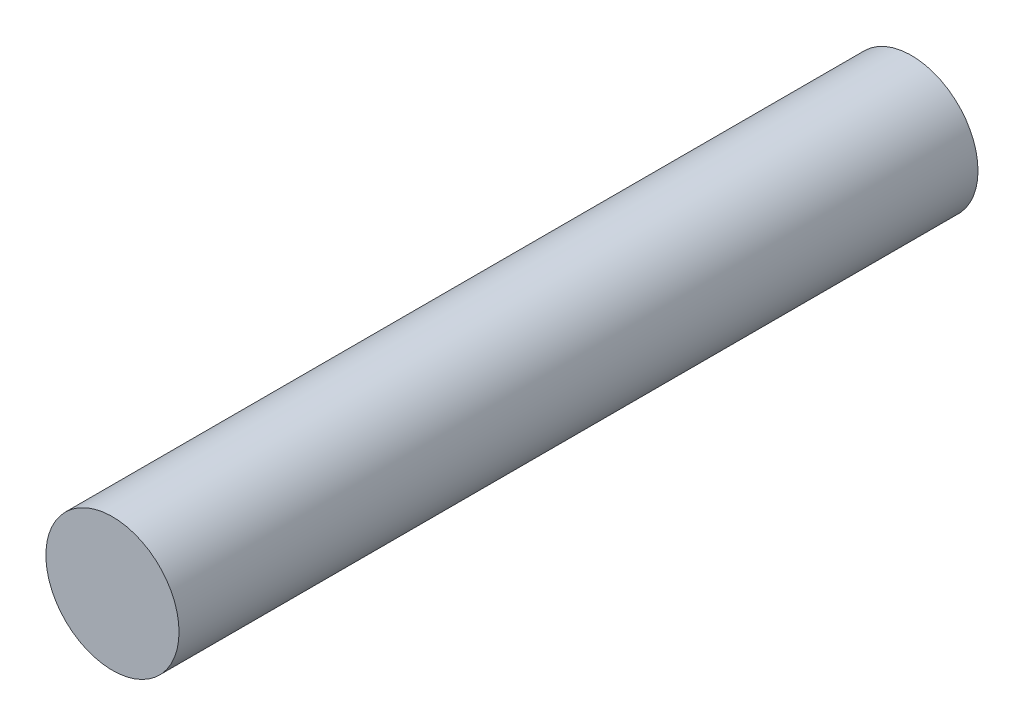
ISO-10303-21;
HEADER;
FILE_DESCRIPTION(('STEP AP214'),'2;1');
FILE_NAME('part.step','',(''),(''),'','','');
FILE_SCHEMA(('AUTOMOTIVE_DESIGN { 1 0 10303 214 1 1 1 1 }'));
ENDSEC;
DATA;
#1=APPLICATION_CONTEXT('core data for automotive mechanical design processes');
#2=APPLICATION_PROTOCOL_DEFINITION('international standard','automotive_design',2000,#1);
#3=PRODUCT_CONTEXT('',#1,'mechanical');
#4=PRODUCT('Part','Part','',(#3));
#5=PRODUCT_RELATED_PRODUCT_CATEGORY('part','',(#4));
#6=PRODUCT_DEFINITION_FORMATION('','',#4);
#7=PRODUCT_DEFINITION_CONTEXT('part definition',#1,'design');
#8=PRODUCT_DEFINITION('design','',#6,#7);
#9=PRODUCT_DEFINITION_SHAPE('','',#8);
#10=(LENGTH_UNIT() NAMED_UNIT(*) SI_UNIT(.MILLI.,.METRE.));
#11=(NAMED_UNIT(*) PLANE_ANGLE_UNIT() SI_UNIT($,.RADIAN.));
#12=(NAMED_UNIT(*) SI_UNIT($,.STERADIAN.) SOLID_ANGLE_UNIT());
#13=UNCERTAINTY_MEASURE_WITH_UNIT(LENGTH_MEASURE(1.E-05),#10,'distance_accuracy_value','');
#14=(GEOMETRIC_REPRESENTATION_CONTEXT(3) GLOBAL_UNCERTAINTY_ASSIGNED_CONTEXT((#13)) GLOBAL_UNIT_ASSIGNED_CONTEXT((#10,
#11,#12)) REPRESENTATION_CONTEXT('',''));
#15=CARTESIAN_POINT('',(0.,0.,0.));
#16=DIRECTION('',(0.,0.,1.));
#17=DIRECTION('',(1.,0.,0.));
#18=AXIS2_PLACEMENT_3D('',#15,#16,#17);
#19=CARTESIAN_POINT('',(0.,0.,152.4));
#20=DIRECTION('',(0.,0.,-1.));
#21=DIRECTION('',(-1.,0.,0.));
#22=AXIS2_PLACEMENT_3D('',#19,#20,#21);
#23=CYLINDRICAL_SURFACE('',#22,12.7);
#24=CARTESIAN_POINT('',(0.,0.,152.4));
#25=DIRECTION('',(0.,0.,1.));
#26=DIRECTION('',(1.,0.,0.));
#27=AXIS2_PLACEMENT_3D('',#24,#25,#26);
#28=CIRCLE('',#27,12.7);
#29=CARTESIAN_POINT('',(12.7,0.,152.4));
#30=VERTEX_POINT('',#29);
#31=EDGE_CURVE('E10',#30,#30,#28,.T.);
#32=ORIENTED_EDGE('',*,*,#31,.F.);
#33=EDGE_LOOP('',(#32));
#34=FACE_BOUND('',#33,.T.);
#35=CARTESIAN_POINT('',(0.,0.,0.));
#36=DIRECTION('',(0.,0.,1.));
#37=DIRECTION('',(1.,0.,0.));
#38=AXIS2_PLACEMENT_3D('',#35,#36,#37);
#39=CIRCLE('',#38,12.7);
#40=CARTESIAN_POINT('',(12.7,0.,0.));
#41=VERTEX_POINT('',#40);
#42=EDGE_CURVE('E37',#41,#41,#39,.T.);
#43=ORIENTED_EDGE('',*,*,#42,.T.);
#44=EDGE_LOOP('',(#43));
#45=FACE_BOUND('',#44,.T.);
#46=ADVANCED_FACE('F34',(#34,#45),#23,.T.);
#47=CARTESIAN_POINT('',(0.,0.,152.4));
#48=DIRECTION('',(0.,0.,1.));
#49=DIRECTION('',(1.,0.,0.));
#50=AXIS2_PLACEMENT_3D('',#47,#48,#49);
#51=PLANE('',#50);
#52=ORIENTED_EDGE('',*,*,#31,.T.);
#53=EDGE_LOOP('',(#52));
#54=FACE_BOUND('',#53,.T.);
#55=ADVANCED_FACE('F49',(#54),#51,.T.);
#56=CARTESIAN_POINT('',(0.,0.,0.));
#57=DIRECTION('',(0.,0.,1.));
#58=DIRECTION('',(1.,0.,0.));
#59=AXIS2_PLACEMENT_3D('',#56,#57,#58);
#60=PLANE('',#59);
#61=ORIENTED_EDGE('',*,*,#42,.F.);
#62=EDGE_LOOP('',(#61));
#63=FACE_BOUND('',#62,.T.);
#64=ADVANCED_FACE('F47',(#63),#60,.F.);
#65=CLOSED_SHELL('',(#46,#55,#64));
#66=MANIFOLD_SOLID_BREP('B2',#65);
#67=ADVANCED_BREP_SHAPE_REPRESENTATION('',(#18,#66),#14);
#68=SHAPE_DEFINITION_REPRESENTATION(#9,#67);
ENDSEC;
END-ISO-10303-21;
